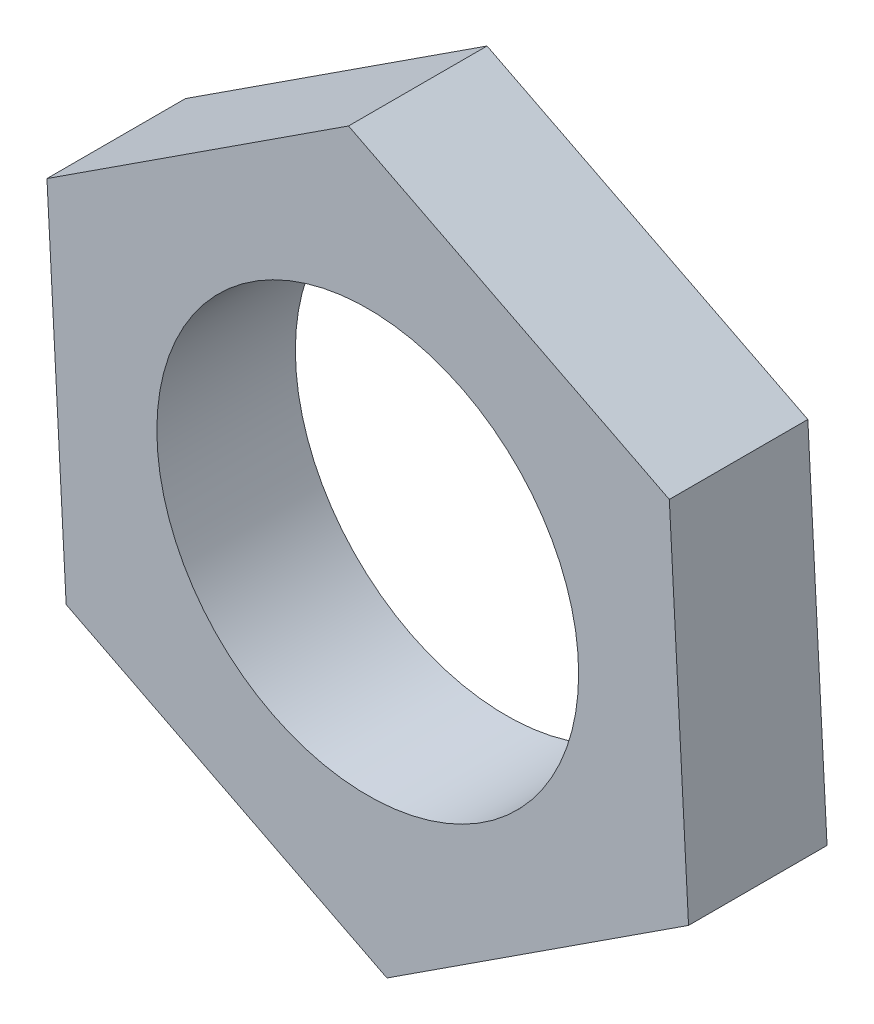
ISO-10303-21;
HEADER;
FILE_DESCRIPTION(('STEP AP214'),'2;1');
FILE_NAME('part.step','',(''),(''),'','','');
FILE_SCHEMA(('AUTOMOTIVE_DESIGN { 1 0 10303 214 1 1 1 1 }'));
ENDSEC;
DATA;
#1=APPLICATION_CONTEXT('core data for automotive mechanical design processes');
#2=APPLICATION_PROTOCOL_DEFINITION('international standard','automotive_design',2000,#1);
#3=PRODUCT_CONTEXT('',#1,'mechanical');
#4=PRODUCT('Part','Part','',(#3));
#5=PRODUCT_RELATED_PRODUCT_CATEGORY('part','',(#4));
#6=PRODUCT_DEFINITION_FORMATION('','',#4);
#7=PRODUCT_DEFINITION_CONTEXT('part definition',#1,'design');
#8=PRODUCT_DEFINITION('design','',#6,#7);
#9=PRODUCT_DEFINITION_SHAPE('','',#8);
#10=(LENGTH_UNIT() NAMED_UNIT(*) SI_UNIT(.MILLI.,.METRE.));
#11=(NAMED_UNIT(*) PLANE_ANGLE_UNIT() SI_UNIT($,.RADIAN.));
#12=(NAMED_UNIT(*) SI_UNIT($,.STERADIAN.) SOLID_ANGLE_UNIT());
#13=UNCERTAINTY_MEASURE_WITH_UNIT(LENGTH_MEASURE(1.E-05),#10,'distance_accuracy_value','');
#14=(GEOMETRIC_REPRESENTATION_CONTEXT(3) GLOBAL_UNCERTAINTY_ASSIGNED_CONTEXT((#13)) GLOBAL_UNIT_ASSIGNED_CONTEXT((#10,
#11,#12)) REPRESENTATION_CONTEXT('',''));
#15=CARTESIAN_POINT('',(0.,0.,0.));
#16=DIRECTION('',(0.,0.,1.));
#17=DIRECTION('',(1.,0.,0.));
#18=AXIS2_PLACEMENT_3D('',#15,#16,#17);
#19=CARTESIAN_POINT('',(0.,0.,2.2));
#20=DIRECTION('',(0.,0.,1.));
#21=DIRECTION('',(1.,0.,0.));
#22=AXIS2_PLACEMENT_3D('',#19,#20,#21);
#23=PLANE('',#22);
#24=DIRECTION('',(0.891496775117497,-0.453027041085964,0.));
#25=VECTOR('',#24,1.);
#26=CARTESIAN_POINT('',(-4.79027807369958,-3.11821038043186,2.2));
#27=LINE('',#26,#25);
#28=CARTESIAN_POINT('',(-4.79027807369958,-3.11821038043186,2.2));
#29=VERTEX_POINT('',#28);
#30=CARTESIAN_POINT('',(0.305310366948541,-5.70760769323136,2.2));
#31=VERTEX_POINT('',#30);
#32=EDGE_CURVE('E134',#29,#31,#27,.T.);
#33=ORIENTED_EDGE('',*,*,#32,.T.);
#34=DIRECTION('',(0.838081313740489,0.545545334100673,0.));
#35=VECTOR('',#34,1.);
#36=CARTESIAN_POINT('',(0.305310366948541,-5.70760769323136,2.2));
#37=LINE('',#36,#35);
#38=CARTESIAN_POINT('',(5.09558844064812,-2.58939731279949,2.2));
#39=VERTEX_POINT('',#38);
#40=EDGE_CURVE('E92',#31,#39,#37,.T.);
#41=ORIENTED_EDGE('',*,*,#40,.T.);
#42=DIRECTION('',(-0.0534154613770074,0.998572375186637,0.));
#43=VECTOR('',#42,1.);
#44=CARTESIAN_POINT('',(5.09558844064812,-2.58939731279949,2.2));
#45=LINE('',#44,#43);
#46=CARTESIAN_POINT('',(4.79027807369958,3.11821038043187,2.2));
#47=VERTEX_POINT('',#46);
#48=EDGE_CURVE('E105',#39,#47,#45,.T.);
#49=ORIENTED_EDGE('',*,*,#48,.T.);
#50=DIRECTION('',(-0.891496775117497,0.453027041085964,0.));
#51=VECTOR('',#50,1.);
#52=CARTESIAN_POINT('',(4.79027807369958,3.11821038043187,2.2));
#53=LINE('',#52,#51);
#54=CARTESIAN_POINT('',(-0.305310366948541,5.70760769323136,2.2));
#55=VERTEX_POINT('',#54);
#56=EDGE_CURVE('E99',#47,#55,#53,.T.);
#57=ORIENTED_EDGE('',*,*,#56,.T.);
#58=DIRECTION('',(-0.838081313740489,-0.545545334100673,0.));
#59=VECTOR('',#58,1.);
#60=CARTESIAN_POINT('',(-0.305310366948541,5.70760769323136,2.2));
#61=LINE('',#60,#59);
#62=CARTESIAN_POINT('',(-5.09558844064812,2.58939731279949,2.2));
#63=VERTEX_POINT('',#62);
#64=EDGE_CURVE('E103',#55,#63,#61,.T.);
#65=ORIENTED_EDGE('',*,*,#64,.T.);
#66=DIRECTION('',(0.0534154613770072,-0.998572375186637,0.));
#67=VECTOR('',#66,1.);
#68=CARTESIAN_POINT('',(-5.09558844064812,2.58939731279949,2.2));
#69=LINE('',#68,#67);
#70=EDGE_CURVE('E55',#63,#29,#69,.T.);
#71=ORIENTED_EDGE('',*,*,#70,.T.);
#72=EDGE_LOOP('',(#33,#41,#49,#57,#65,#71));
#73=FACE_BOUND('',#72,.T.);
#74=CARTESIAN_POINT('',(0.,0.,2.2));
#75=DIRECTION('',(0.,0.,1.));
#76=DIRECTION('',(1.,0.,0.));
#77=AXIS2_PLACEMENT_3D('',#74,#75,#76);
#78=CIRCLE('',#77,3.35);
#79=CARTESIAN_POINT('',(3.35,0.,2.2));
#80=VERTEX_POINT('',#79);
#81=EDGE_CURVE('E127',#80,#80,#78,.T.);
#82=ORIENTED_EDGE('',*,*,#81,.F.);
#83=EDGE_LOOP('',(#82));
#84=FACE_BOUND('',#83,.T.);
#85=ADVANCED_FACE('F38',(#73,#84),#23,.T.);
#86=CARTESIAN_POINT('',(0.,0.,0.));
#87=DIRECTION('',(0.,0.,1.));
#88=DIRECTION('',(1.,0.,0.));
#89=AXIS2_PLACEMENT_3D('',#86,#87,#88);
#90=PLANE('',#89);
#91=DIRECTION('',(0.891496775117497,-0.453027041085964,0.));
#92=VECTOR('',#91,1.);
#93=CARTESIAN_POINT('',(-4.79027807369958,-3.11821038043186,0.));
#94=LINE('',#93,#92);
#95=CARTESIAN_POINT('',(-4.79027807369958,-3.11821038043186,0.));
#96=VERTEX_POINT('',#95);
#97=CARTESIAN_POINT('',(0.305310366948541,-5.70760769323136,0.));
#98=VERTEX_POINT('',#97);
#99=EDGE_CURVE('E123',#96,#98,#94,.T.);
#100=ORIENTED_EDGE('',*,*,#99,.F.);
#101=DIRECTION('',(0.0534154613770072,-0.998572375186637,0.));
#102=VECTOR('',#101,1.);
#103=CARTESIAN_POINT('',(-5.09558844064812,2.58939731279949,0.));
#104=LINE('',#103,#102);
#105=CARTESIAN_POINT('',(-5.09558844064812,2.58939731279949,0.));
#106=VERTEX_POINT('',#105);
#107=EDGE_CURVE('E84',#106,#96,#104,.T.);
#108=ORIENTED_EDGE('',*,*,#107,.F.);
#109=DIRECTION('',(-0.838081313740489,-0.545545334100673,0.));
#110=VECTOR('',#109,1.);
#111=CARTESIAN_POINT('',(-0.305310366948541,5.70760769323136,0.));
#112=LINE('',#111,#110);
#113=CARTESIAN_POINT('',(-0.305310366948541,5.70760769323136,0.));
#114=VERTEX_POINT('',#113);
#115=EDGE_CURVE('E78',#114,#106,#112,.T.);
#116=ORIENTED_EDGE('',*,*,#115,.F.);
#117=DIRECTION('',(-0.891496775117497,0.453027041085964,0.));
#118=VECTOR('',#117,1.);
#119=CARTESIAN_POINT('',(4.79027807369958,3.11821038043187,0.));
#120=LINE('',#119,#118);
#121=CARTESIAN_POINT('',(4.79027807369958,3.11821038043187,0.));
#122=VERTEX_POINT('',#121);
#123=EDGE_CURVE('E113',#122,#114,#120,.T.);
#124=ORIENTED_EDGE('',*,*,#123,.F.);
#125=DIRECTION('',(-0.0534154613770074,0.998572375186637,0.));
#126=VECTOR('',#125,1.);
#127=CARTESIAN_POINT('',(5.09558844064812,-2.58939731279949,0.));
#128=LINE('',#127,#126);
#129=CARTESIAN_POINT('',(5.09558844064812,-2.58939731279949,0.));
#130=VERTEX_POINT('',#129);
#131=EDGE_CURVE('E129',#130,#122,#128,.T.);
#132=ORIENTED_EDGE('',*,*,#131,.F.);
#133=DIRECTION('',(0.838081313740489,0.545545334100673,0.));
#134=VECTOR('',#133,1.);
#135=CARTESIAN_POINT('',(0.305310366948541,-5.70760769323136,0.));
#136=LINE('',#135,#134);
#137=EDGE_CURVE('E126',#98,#130,#136,.T.);
#138=ORIENTED_EDGE('',*,*,#137,.F.);
#139=EDGE_LOOP('',(#100,#108,#116,#124,#132,#138));
#140=FACE_BOUND('',#139,.T.);
#141=CARTESIAN_POINT('',(0.,0.,0.));
#142=DIRECTION('',(0.,0.,1.));
#143=DIRECTION('',(1.,0.,0.));
#144=AXIS2_PLACEMENT_3D('',#141,#142,#143);
#145=CIRCLE('',#144,3.35);
#146=CARTESIAN_POINT('',(3.35,0.,0.));
#147=VERTEX_POINT('',#146);
#148=EDGE_CURVE('E233',#147,#147,#145,.T.);
#149=ORIENTED_EDGE('',*,*,#148,.T.);
#150=EDGE_LOOP('',(#149));
#151=FACE_BOUND('',#150,.T.);
#152=ADVANCED_FACE('F143',(#140,#151),#90,.F.);
#153=CARTESIAN_POINT('',(-4.79027807369958,-3.11821038043186,2.2));
#154=DIRECTION('',(0.453027041085964,0.891496775117497,0.));
#155=DIRECTION('',(-0.891496775117497,0.453027041085964,0.));
#156=AXIS2_PLACEMENT_3D('',#153,#154,#155);
#157=PLANE('',#156);
#158=ORIENTED_EDGE('',*,*,#99,.T.);
#159=DIRECTION('',(0.,0.,-1.));
#160=VECTOR('',#159,1.);
#161=CARTESIAN_POINT('',(0.305310366948541,-5.70760769323136,2.2));
#162=LINE('',#161,#160);
#163=EDGE_CURVE('E11',#31,#98,#162,.T.);
#164=ORIENTED_EDGE('',*,*,#163,.F.);
#165=ORIENTED_EDGE('',*,*,#32,.F.);
#166=DIRECTION('',(0.,0.,-1.));
#167=VECTOR('',#166,1.);
#168=CARTESIAN_POINT('',(-4.79027807369958,-3.11821038043186,2.2));
#169=LINE('',#168,#167);
#170=EDGE_CURVE('E119',#29,#96,#169,.T.);
#171=ORIENTED_EDGE('',*,*,#170,.T.);
#172=EDGE_LOOP('',(#158,#164,#165,#171));
#173=FACE_BOUND('',#172,.T.);
#174=ADVANCED_FACE('F40',(#173),#157,.F.);
#175=CARTESIAN_POINT('',(0.305310366948541,-5.70760769323136,2.2));
#176=DIRECTION('',(-0.545545334100673,0.838081313740489,0.));
#177=DIRECTION('',(-0.838081313740489,-0.545545334100673,0.));
#178=AXIS2_PLACEMENT_3D('',#175,#176,#177);
#179=PLANE('',#178);
#180=ORIENTED_EDGE('',*,*,#137,.T.);
#181=DIRECTION('',(0.,0.,-1.));
#182=VECTOR('',#181,1.);
#183=CARTESIAN_POINT('',(5.09558844064812,-2.58939731279949,2.2));
#184=LINE('',#183,#182);
#185=EDGE_CURVE('E47',#39,#130,#184,.T.);
#186=ORIENTED_EDGE('',*,*,#185,.F.);
#187=ORIENTED_EDGE('',*,*,#40,.F.);
#188=ORIENTED_EDGE('',*,*,#163,.T.);
#189=EDGE_LOOP('',(#180,#186,#187,#188));
#190=FACE_BOUND('',#189,.T.);
#191=ADVANCED_FACE('F168',(#190),#179,.F.);
#192=CARTESIAN_POINT('',(5.09558844064812,-2.58939731279949,2.2));
#193=DIRECTION('',(-0.998572375186637,-0.0534154613770074,0.));
#194=DIRECTION('',(0.0534154613770074,-0.998572375186637,0.));
#195=AXIS2_PLACEMENT_3D('',#192,#193,#194);
#196=PLANE('',#195);
#197=ORIENTED_EDGE('',*,*,#131,.T.);
#198=DIRECTION('',(0.,0.,-1.));
#199=VECTOR('',#198,1.);
#200=CARTESIAN_POINT('',(4.79027807369958,3.11821038043187,2.2));
#201=LINE('',#200,#199);
#202=EDGE_CURVE('E114',#47,#122,#201,.T.);
#203=ORIENTED_EDGE('',*,*,#202,.F.);
#204=ORIENTED_EDGE('',*,*,#48,.F.);
#205=ORIENTED_EDGE('',*,*,#185,.T.);
#206=EDGE_LOOP('',(#197,#203,#204,#205));
#207=FACE_BOUND('',#206,.T.);
#208=ADVANCED_FACE('F140',(#207),#196,.F.);
#209=CARTESIAN_POINT('',(4.79027807369958,3.11821038043187,2.2));
#210=DIRECTION('',(-0.453027041085964,-0.891496775117497,0.));
#211=DIRECTION('',(0.891496775117497,-0.453027041085964,0.));
#212=AXIS2_PLACEMENT_3D('',#209,#210,#211);
#213=PLANE('',#212);
#214=ORIENTED_EDGE('',*,*,#123,.T.);
#215=DIRECTION('',(0.,0.,-1.));
#216=VECTOR('',#215,1.);
#217=CARTESIAN_POINT('',(-0.305310366948541,5.70760769323136,2.2));
#218=LINE('',#217,#216);
#219=EDGE_CURVE('E110',#55,#114,#218,.T.);
#220=ORIENTED_EDGE('',*,*,#219,.F.);
#221=ORIENTED_EDGE('',*,*,#56,.F.);
#222=ORIENTED_EDGE('',*,*,#202,.T.);
#223=EDGE_LOOP('',(#214,#220,#221,#222));
#224=FACE_BOUND('',#223,.T.);
#225=ADVANCED_FACE('F111',(#224),#213,.F.);
#226=CARTESIAN_POINT('',(-0.305310366948541,5.70760769323136,2.2));
#227=DIRECTION('',(0.545545334100673,-0.83808131374049,0.));
#228=DIRECTION('',(0.83808131374049,0.545545334100673,0.));
#229=AXIS2_PLACEMENT_3D('',#226,#227,#228);
#230=PLANE('',#229);
#231=ORIENTED_EDGE('',*,*,#115,.T.);
#232=DIRECTION('',(0.,0.,-1.));
#233=VECTOR('',#232,1.);
#234=CARTESIAN_POINT('',(-5.09558844064812,2.58939731279949,2.2));
#235=LINE('',#234,#233);
#236=EDGE_CURVE('E115',#63,#106,#235,.T.);
#237=ORIENTED_EDGE('',*,*,#236,.F.);
#238=ORIENTED_EDGE('',*,*,#64,.F.);
#239=ORIENTED_EDGE('',*,*,#219,.T.);
#240=EDGE_LOOP('',(#231,#237,#238,#239));
#241=FACE_BOUND('',#240,.T.);
#242=ADVANCED_FACE('F117',(#241),#230,.F.);
#243=CARTESIAN_POINT('',(-5.09558844064812,2.58939731279949,2.2));
#244=DIRECTION('',(0.998572375186637,0.0534154613770072,0.));
#245=DIRECTION('',(-0.0534154613770072,0.998572375186637,0.));
#246=AXIS2_PLACEMENT_3D('',#243,#244,#245);
#247=PLANE('',#246);
#248=ORIENTED_EDGE('',*,*,#107,.T.);
#249=ORIENTED_EDGE('',*,*,#170,.F.);
#250=ORIENTED_EDGE('',*,*,#70,.F.);
#251=ORIENTED_EDGE('',*,*,#236,.T.);
#252=EDGE_LOOP('',(#248,#249,#250,#251));
#253=FACE_BOUND('',#252,.T.);
#254=ADVANCED_FACE('F148',(#253),#247,.F.);
#255=CARTESIAN_POINT('',(0.,0.,2.2));
#256=DIRECTION('',(0.,0.,-1.));
#257=DIRECTION('',(-1.,0.,0.));
#258=AXIS2_PLACEMENT_3D('',#255,#256,#257);
#259=CYLINDRICAL_SURFACE('',#258,3.35);
#260=ORIENTED_EDGE('',*,*,#81,.T.);
#261=EDGE_LOOP('',(#260));
#262=FACE_BOUND('',#261,.T.);
#263=ORIENTED_EDGE('',*,*,#148,.F.);
#264=EDGE_LOOP('',(#263));
#265=FACE_BOUND('',#264,.T.);
#266=ADVANCED_FACE('F150',(#262,#265),#259,.F.);
#267=CLOSED_SHELL('',(#85,#152,#174,#191,#208,#225,#242,#254,#266));
#268=MANIFOLD_SOLID_BREP('B2',#267);
#269=ADVANCED_BREP_SHAPE_REPRESENTATION('',(#18,#268),#14);
#270=SHAPE_DEFINITION_REPRESENTATION(#9,#269);
ENDSEC;
END-ISO-10303-21;
